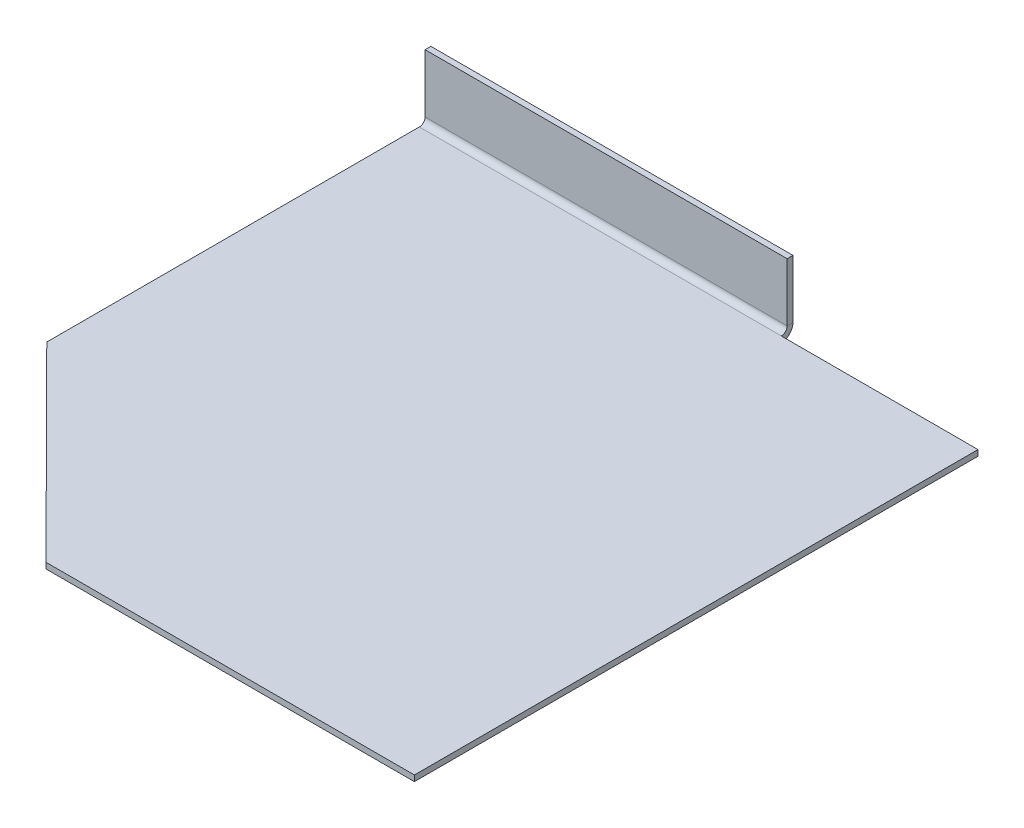
ISO-10303-21;
HEADER;
FILE_DESCRIPTION(('STEP AP214'),'2;1');
FILE_NAME('part.step','',(''),(''),'','','');
FILE_SCHEMA(('AUTOMOTIVE_DESIGN { 1 0 10303 214 1 1 1 1 }'));
ENDSEC;
DATA;
#1=APPLICATION_CONTEXT('core data for automotive mechanical design processes');
#2=APPLICATION_PROTOCOL_DEFINITION('international standard','automotive_design',2000,#1);
#3=PRODUCT_CONTEXT('',#1,'mechanical');
#4=PRODUCT('Part','Part','',(#3));
#5=PRODUCT_RELATED_PRODUCT_CATEGORY('part','',(#4));
#6=PRODUCT_DEFINITION_FORMATION('','',#4);
#7=PRODUCT_DEFINITION_CONTEXT('part definition',#1,'design');
#8=PRODUCT_DEFINITION('design','',#6,#7);
#9=PRODUCT_DEFINITION_SHAPE('','',#8);
#10=(LENGTH_UNIT() NAMED_UNIT(*) SI_UNIT(.MILLI.,.METRE.));
#11=(NAMED_UNIT(*) PLANE_ANGLE_UNIT() SI_UNIT($,.RADIAN.));
#12=(NAMED_UNIT(*) SI_UNIT($,.STERADIAN.) SOLID_ANGLE_UNIT());
#13=UNCERTAINTY_MEASURE_WITH_UNIT(LENGTH_MEASURE(1.E-05),#10,'distance_accuracy_value','');
#14=(GEOMETRIC_REPRESENTATION_CONTEXT(3) GLOBAL_UNCERTAINTY_ASSIGNED_CONTEXT((#13)) GLOBAL_UNIT_ASSIGNED_CONTEXT((#10,
#11,#12)) REPRESENTATION_CONTEXT('',''));
#15=CARTESIAN_POINT('',(0.,0.,0.));
#16=DIRECTION('',(0.,0.,1.));
#17=DIRECTION('',(1.,0.,0.));
#18=AXIS2_PLACEMENT_3D('',#15,#16,#17);
#19=CARTESIAN_POINT('',(50.84064,-3.175,-599.346330946073));
#20=DIRECTION('',(0.,0.,1.));
#21=DIRECTION('',(1.,0.,0.));
#22=AXIS2_PLACEMENT_3D('',#19,#20,#21);
#23=PLANE('',#22);
#24=DIRECTION('',(0.,-1.,0.));
#25=VECTOR('',#24,1.);
#26=CARTESIAN_POINT('',(248.353520055999,0.,-599.346330946073));
#27=LINE('',#26,#25);
#28=CARTESIAN_POINT('',(248.353520055999,0.,-599.346330946073));
#29=VERTEX_POINT('',#28);
#30=CARTESIAN_POINT('',(248.353520055999,-3.17500000000002,-599.346330946073));
#31=VERTEX_POINT('',#30);
#32=EDGE_CURVE('E75',#29,#31,#27,.T.);
#33=ORIENTED_EDGE('',*,*,#32,.F.);
#34=DIRECTION('',(1.,0.,0.));
#35=VECTOR('',#34,1.);
#36=CARTESIAN_POINT('',(50.84064,0.,-599.346330946073));
#37=LINE('',#36,#35);
#38=CARTESIAN_POINT('',(355.64064,0.,-599.346330946073));
#39=VERTEX_POINT('',#38);
#40=EDGE_CURVE('E131',#29,#39,#37,.T.);
#41=ORIENTED_EDGE('',*,*,#40,.T.);
#42=DIRECTION('',(0.,1.,0.));
#43=VECTOR('',#42,1.);
#44=CARTESIAN_POINT('',(355.64064,-3.175,-599.346330946073));
#45=LINE('',#44,#43);
#46=CARTESIAN_POINT('',(355.64064,-3.175,-599.346330946073));
#47=VERTEX_POINT('',#46);
#48=EDGE_CURVE('E130',#47,#39,#45,.T.);
#49=ORIENTED_EDGE('',*,*,#48,.F.);
#50=DIRECTION('',(1.,0.,0.));
#51=VECTOR('',#50,1.);
#52=CARTESIAN_POINT('',(50.84064,-3.175,-599.346330946073));
#53=LINE('',#52,#51);
#54=EDGE_CURVE('E120',#31,#47,#53,.T.);
#55=ORIENTED_EDGE('',*,*,#54,.F.);
#56=EDGE_LOOP('',(#33,#41,#49,#55));
#57=FACE_BOUND('',#56,.T.);
#58=ADVANCED_FACE('F58',(#57),#23,.F.);
#59=CARTESIAN_POINT('',(50.84064,-3.175,-396.146330946073));
#60=DIRECTION('',(-0.708537940146742,0.,0.705672719731047));
#61=DIRECTION('',(0.705672719731047,0.,0.708537940146742));
#62=AXIS2_PLACEMENT_3D('',#59,#60,#61);
#63=PLANE('',#62);
#64=DIRECTION('',(0.705672719731047,0.,0.708537940146742));
#65=VECTOR('',#64,1.);
#66=CARTESIAN_POINT('',(50.84064,0.,-396.146330946073));
#67=LINE('',#66,#65);
#68=CARTESIAN_POINT('',(50.84064,0.,-396.146330946073));
#69=VERTEX_POINT('',#68);
#70=CARTESIAN_POINT('',(154.686,0.,-291.879330946073));
#71=VERTEX_POINT('',#70);
#72=EDGE_CURVE('E146',#69,#71,#67,.T.);
#73=ORIENTED_EDGE('',*,*,#72,.F.);
#74=DIRECTION('',(0.,1.,0.));
#75=VECTOR('',#74,1.);
#76=CARTESIAN_POINT('',(50.84064,-3.175,-396.146330946073));
#77=LINE('',#76,#75);
#78=CARTESIAN_POINT('',(50.84064,-3.175,-396.146330946073));
#79=VERTEX_POINT('',#78);
#80=EDGE_CURVE('E13',#79,#69,#77,.T.);
#81=ORIENTED_EDGE('',*,*,#80,.F.);
#82=DIRECTION('',(0.705672719731047,0.,0.708537940146742));
#83=VECTOR('',#82,1.);
#84=CARTESIAN_POINT('',(50.84064,-3.175,-396.146330946073));
#85=LINE('',#84,#83);
#86=CARTESIAN_POINT('',(154.686,-3.175,-291.879330946073));
#87=VERTEX_POINT('',#86);
#88=EDGE_CURVE('E140',#79,#87,#85,.T.);
#89=ORIENTED_EDGE('',*,*,#88,.T.);
#90=DIRECTION('',(0.,1.,0.));
#91=VECTOR('',#90,1.);
#92=CARTESIAN_POINT('',(154.686,-3.175,-291.879330946073));
#93=LINE('',#92,#91);
#94=EDGE_CURVE('E62',#87,#71,#93,.T.);
#95=ORIENTED_EDGE('',*,*,#94,.T.);
#96=EDGE_LOOP('',(#73,#81,#89,#95));
#97=FACE_BOUND('',#96,.T.);
#98=ADVANCED_FACE('F60',(#97),#63,.T.);
#99=CARTESIAN_POINT('',(50.84064,-3.175,-396.146330946073));
#100=DIRECTION('',(1.,0.,0.));
#101=DIRECTION('',(0.,0.,-1.));
#102=AXIS2_PLACEMENT_3D('',#99,#100,#101);
#103=PLANE('',#102);
#104=DIRECTION('',(0.,0.,-1.));
#105=VECTOR('',#104,1.);
#106=CARTESIAN_POINT('',(50.84064,0.,-396.146330946073));
#107=LINE('',#106,#105);
#108=CARTESIAN_POINT('',(50.84064,0.,-599.346330946073));
#109=VERTEX_POINT('',#108);
#110=EDGE_CURVE('E157',#69,#109,#107,.T.);
#111=ORIENTED_EDGE('',*,*,#110,.T.);
#112=DIRECTION('',(0.,1.,0.));
#113=VECTOR('',#112,1.);
#114=CARTESIAN_POINT('',(50.84064,-3.175,-599.346330946073));
#115=LINE('',#114,#113);
#116=CARTESIAN_POINT('',(50.84064,-3.175,-599.346330946073));
#117=VERTEX_POINT('',#116);
#118=EDGE_CURVE('E67',#117,#109,#115,.T.);
#119=ORIENTED_EDGE('',*,*,#118,.F.);
#120=DIRECTION('',(0.,0.,-1.));
#121=VECTOR('',#120,1.);
#122=CARTESIAN_POINT('',(50.84064,-3.175,-396.146330946073));
#123=LINE('',#122,#121);
#124=EDGE_CURVE('E144',#79,#117,#123,.T.);
#125=ORIENTED_EDGE('',*,*,#124,.F.);
#126=ORIENTED_EDGE('',*,*,#80,.T.);
#127=EDGE_LOOP('',(#111,#119,#125,#126));
#128=FACE_BOUND('',#127,.T.);
#129=ADVANCED_FACE('F165',(#128),#103,.F.);
#130=CARTESIAN_POINT('',(355.64064,-3.175,-291.879330946073));
#131=DIRECTION('',(1.,0.,0.));
#132=DIRECTION('',(0.,0.,-1.));
#133=AXIS2_PLACEMENT_3D('',#130,#131,#132);
#134=PLANE('',#133);
#135=DIRECTION('',(0.,0.,-1.));
#136=VECTOR('',#135,1.);
#137=CARTESIAN_POINT('',(355.64064,0.,-291.879330946073));
#138=LINE('',#137,#136);
#139=CARTESIAN_POINT('',(355.64064,0.,-291.879330946073));
#140=VERTEX_POINT('',#139);
#141=EDGE_CURVE('E152',#140,#39,#138,.T.);
#142=ORIENTED_EDGE('',*,*,#141,.F.);
#143=DIRECTION('',(0.,1.,0.));
#144=VECTOR('',#143,1.);
#145=CARTESIAN_POINT('',(355.64064,-3.175,-291.879330946073));
#146=LINE('',#145,#144);
#147=CARTESIAN_POINT('',(355.64064,-3.175,-291.879330946073));
#148=VERTEX_POINT('',#147);
#149=EDGE_CURVE('E135',#148,#140,#146,.T.);
#150=ORIENTED_EDGE('',*,*,#149,.F.);
#151=DIRECTION('',(0.,0.,-1.));
#152=VECTOR('',#151,1.);
#153=CARTESIAN_POINT('',(355.64064,-3.175,-291.879330946073));
#154=LINE('',#153,#152);
#155=EDGE_CURVE('E125',#148,#47,#154,.T.);
#156=ORIENTED_EDGE('',*,*,#155,.T.);
#157=ORIENTED_EDGE('',*,*,#48,.T.);
#158=EDGE_LOOP('',(#142,#150,#156,#157));
#159=FACE_BOUND('',#158,.T.);
#160=ADVANCED_FACE('F137',(#159),#134,.T.);
#161=CARTESIAN_POINT('',(154.686,-3.175,-291.879330946073));
#162=DIRECTION('',(0.,0.,1.));
#163=DIRECTION('',(1.,0.,0.));
#164=AXIS2_PLACEMENT_3D('',#161,#162,#163);
#165=PLANE('',#164);
#166=DIRECTION('',(1.,0.,0.));
#167=VECTOR('',#166,1.);
#168=CARTESIAN_POINT('',(154.686,0.,-291.879330946073));
#169=LINE('',#168,#167);
#170=EDGE_CURVE('E149',#71,#140,#169,.T.);
#171=ORIENTED_EDGE('',*,*,#170,.F.);
#172=ORIENTED_EDGE('',*,*,#94,.F.);
#173=DIRECTION('',(1.,0.,0.));
#174=VECTOR('',#173,1.);
#175=CARTESIAN_POINT('',(154.686,-3.175,-291.879330946073));
#176=LINE('',#175,#174);
#177=EDGE_CURVE('E138',#87,#148,#176,.T.);
#178=ORIENTED_EDGE('',*,*,#177,.T.);
#179=ORIENTED_EDGE('',*,*,#149,.T.);
#180=EDGE_LOOP('',(#171,#172,#178,#179));
#181=FACE_BOUND('',#180,.T.);
#182=ADVANCED_FACE('F160',(#181),#165,.T.);
#183=CARTESIAN_POINT('',(0.,-3.175,0.));
#184=DIRECTION('',(0.,1.,0.));
#185=DIRECTION('',(0.,0.,1.));
#186=AXIS2_PLACEMENT_3D('',#183,#184,#185);
#187=PLANE('',#186);
#188=ORIENTED_EDGE('',*,*,#88,.F.);
#189=ORIENTED_EDGE('',*,*,#124,.T.);
#190=EDGE_CURVE('E127',#117,#31,#53,.T.);
#191=ORIENTED_EDGE('',*,*,#190,.T.);
#192=ORIENTED_EDGE('',*,*,#54,.T.);
#193=ORIENTED_EDGE('',*,*,#155,.F.);
#194=ORIENTED_EDGE('',*,*,#177,.F.);
#195=EDGE_LOOP('',(#188,#189,#191,#192,#193,#194));
#196=FACE_BOUND('',#195,.T.);
#197=ADVANCED_FACE('F123',(#196),#187,.F.);
#198=CARTESIAN_POINT('',(0.,0.,0.));
#199=DIRECTION('',(0.,1.,0.));
#200=DIRECTION('',(0.,0.,1.));
#201=AXIS2_PLACEMENT_3D('',#198,#199,#200);
#202=PLANE('',#201);
#203=ORIENTED_EDGE('',*,*,#72,.T.);
#204=ORIENTED_EDGE('',*,*,#170,.T.);
#205=ORIENTED_EDGE('',*,*,#141,.T.);
#206=ORIENTED_EDGE('',*,*,#40,.F.);
#207=EDGE_CURVE('E154',#109,#29,#37,.T.);
#208=ORIENTED_EDGE('',*,*,#207,.F.);
#209=ORIENTED_EDGE('',*,*,#110,.F.);
#210=EDGE_LOOP('',(#203,#204,#205,#206,#208,#209));
#211=FACE_BOUND('',#210,.T.);
#212=ADVANCED_FACE('F162',(#211),#202,.T.);
#213=CARTESIAN_POINT('',(248.353520055999,3.17500000000002,-599.346330946073));
#214=DIRECTION('',(1.,0.,0.));
#215=DIRECTION('',(0.,0.,-1.));
#216=AXIS2_PLACEMENT_3D('',#213,#214,#215);
#217=PLANE('',#216);
#218=DIRECTION('',(0.,0.,1.));
#219=VECTOR('',#218,1.);
#220=CARTESIAN_POINT('',(248.353520055999,3.17500000000006,-605.696330946074));
#221=LINE('',#220,#219);
#222=CARTESIAN_POINT('',(248.353520055999,3.17500000000001,-602.521330946073));
#223=VERTEX_POINT('',#222);
#224=CARTESIAN_POINT('',(248.353520055999,3.175,-605.696330946073));
#225=VERTEX_POINT('',#224);
#226=EDGE_CURVE('E206',#223,#225,#221,.F.);
#227=ORIENTED_EDGE('',*,*,#226,.F.);
#228=CARTESIAN_POINT('',(248.353520055999,3.17500000000002,-599.346330946073));
#229=DIRECTION('',(-1.,0.,0.));
#230=DIRECTION('',(0.,0.,1.));
#231=AXIS2_PLACEMENT_3D('',#228,#229,#230);
#232=CIRCLE('',#231,3.17500000000004);
#233=EDGE_CURVE('E184',#29,#223,#232,.F.);
#234=ORIENTED_EDGE('',*,*,#233,.F.);
#235=ORIENTED_EDGE('',*,*,#32,.T.);
#236=CARTESIAN_POINT('',(248.353520055999,3.17500000000002,-599.346330946073));
#237=DIRECTION('',(-1.,0.,0.));
#238=DIRECTION('',(0.,0.,1.));
#239=AXIS2_PLACEMENT_3D('',#236,#237,#238);
#240=CIRCLE('',#239,6.35000000000004);
#241=EDGE_CURVE('E179',#31,#225,#240,.F.);
#242=ORIENTED_EDGE('',*,*,#241,.T.);
#243=EDGE_LOOP('',(#227,#234,#235,#242));
#244=FACE_BOUND('',#243,.T.);
#245=ADVANCED_FACE('F197',(#244),#217,.T.);
#246=CARTESIAN_POINT('',(50.84064,3.17500000000002,-599.346330946073));
#247=DIRECTION('',(1.,0.,0.));
#248=DIRECTION('',(0.,0.,-1.));
#249=AXIS2_PLACEMENT_3D('',#246,#247,#248);
#250=PLANE('',#249);
#251=CARTESIAN_POINT('',(50.84064,3.17500000000002,-599.346330946073));
#252=DIRECTION('',(-1.,0.,0.));
#253=DIRECTION('',(0.,0.,1.));
#254=AXIS2_PLACEMENT_3D('',#251,#252,#253);
#255=CIRCLE('',#254,3.17500000000004);
#256=CARTESIAN_POINT('',(50.84064,3.17500000000001,-602.521330946073));
#257=VERTEX_POINT('',#256);
#258=EDGE_CURVE('E188',#257,#109,#255,.T.);
#259=ORIENTED_EDGE('',*,*,#258,.F.);
#260=DIRECTION('',(0.,0.,1.));
#261=VECTOR('',#260,1.);
#262=CARTESIAN_POINT('',(50.84064,3.17500000000004,-602.521330946073));
#263=LINE('',#262,#261);
#264=CARTESIAN_POINT('',(50.84064,3.17500000000006,-605.696330946073));
#265=VERTEX_POINT('',#264);
#266=EDGE_CURVE('E182',#257,#265,#263,.F.);
#267=ORIENTED_EDGE('',*,*,#266,.T.);
#268=CARTESIAN_POINT('',(50.84064,3.17500000000002,-599.346330946073));
#269=DIRECTION('',(-1.,0.,0.));
#270=DIRECTION('',(0.,0.,1.));
#271=AXIS2_PLACEMENT_3D('',#268,#269,#270);
#272=CIRCLE('',#271,6.35000000000004);
#273=EDGE_CURVE('E176',#265,#117,#272,.T.);
#274=ORIENTED_EDGE('',*,*,#273,.T.);
#275=ORIENTED_EDGE('',*,*,#118,.T.);
#276=EDGE_LOOP('',(#259,#267,#274,#275));
#277=FACE_BOUND('',#276,.T.);
#278=ADVANCED_FACE('F180',(#277),#250,.F.);
#279=CARTESIAN_POINT('',(50.84064,3.17500000000002,-599.346330946073));
#280=DIRECTION('',(-1.,0.,0.));
#281=DIRECTION('',(0.,0.,-1.));
#282=AXIS2_PLACEMENT_3D('',#279,#280,#281);
#283=CYLINDRICAL_SURFACE('',#282,6.35000000000004);
#284=ORIENTED_EDGE('',*,*,#190,.F.);
#285=ORIENTED_EDGE('',*,*,#273,.F.);
#286=DIRECTION('',(-1.,0.,0.));
#287=VECTOR('',#286,1.);
#288=CARTESIAN_POINT('',(0.,3.17500000000006,-605.696330946073));
#289=LINE('',#288,#287);
#290=EDGE_CURVE('E232',#225,#265,#289,.T.);
#291=ORIENTED_EDGE('',*,*,#290,.F.);
#292=ORIENTED_EDGE('',*,*,#241,.F.);
#293=EDGE_LOOP('',(#284,#285,#291,#292));
#294=FACE_BOUND('',#293,.T.);
#295=ADVANCED_FACE('F173',(#294),#283,.T.);
#296=CARTESIAN_POINT('',(50.84064,3.17500000000002,-599.346330946073));
#297=DIRECTION('',(-1.,0.,0.));
#298=DIRECTION('',(0.,0.,-1.));
#299=AXIS2_PLACEMENT_3D('',#296,#297,#298);
#300=CYLINDRICAL_SURFACE('',#299,3.17500000000004);
#301=ORIENTED_EDGE('',*,*,#207,.T.);
#302=ORIENTED_EDGE('',*,*,#233,.T.);
#303=DIRECTION('',(1.,0.,0.));
#304=VECTOR('',#303,1.);
#305=CARTESIAN_POINT('',(248.353520055999,3.17500000000004,-602.521330946073));
#306=LINE('',#305,#304);
#307=EDGE_CURVE('E255',#223,#257,#306,.F.);
#308=ORIENTED_EDGE('',*,*,#307,.T.);
#309=ORIENTED_EDGE('',*,*,#258,.T.);
#310=EDGE_LOOP('',(#301,#302,#308,#309));
#311=FACE_BOUND('',#310,.T.);
#312=ADVANCED_FACE('F291',(#311),#300,.F.);
#313=CARTESIAN_POINT('',(50.84064,34.925,-605.696330946073));
#314=DIRECTION('',(1.,0.,0.));
#315=DIRECTION('',(0.,1.,0.));
#316=AXIS2_PLACEMENT_3D('',#313,#314,#315);
#317=PLANE('',#316);
#318=ORIENTED_EDGE('',*,*,#266,.F.);
#319=DIRECTION('',(0.,1.,0.));
#320=VECTOR('',#319,1.);
#321=CARTESIAN_POINT('',(50.84064,34.925,-602.521330946073));
#322=LINE('',#321,#320);
#323=CARTESIAN_POINT('',(50.84064,34.925,-602.521330946073));
#324=VERTEX_POINT('',#323);
#325=EDGE_CURVE('E227',#257,#324,#322,.T.);
#326=ORIENTED_EDGE('',*,*,#325,.T.);
#327=DIRECTION('',(0.,0.,1.));
#328=VECTOR('',#327,1.);
#329=CARTESIAN_POINT('',(50.84064,34.925,-605.696330946073));
#330=LINE('',#329,#328);
#331=CARTESIAN_POINT('',(50.84064,34.925,-605.696330946073));
#332=VERTEX_POINT('',#331);
#333=EDGE_CURVE('E193',#332,#324,#330,.T.);
#334=ORIENTED_EDGE('',*,*,#333,.F.);
#335=DIRECTION('',(0.,-1.,0.));
#336=VECTOR('',#335,1.);
#337=CARTESIAN_POINT('',(50.84064,-1.9264351294444E-12,-605.696330946073));
#338=LINE('',#337,#336);
#339=EDGE_CURVE('E250',#265,#332,#338,.F.);
#340=ORIENTED_EDGE('',*,*,#339,.F.);
#341=EDGE_LOOP('',(#318,#326,#334,#340));
#342=FACE_BOUND('',#341,.T.);
#343=ADVANCED_FACE('F228',(#342),#317,.F.);
#344=CARTESIAN_POINT('',(248.353520055999,34.925,-605.696330946073));
#345=DIRECTION('',(-1.,0.,0.));
#346=DIRECTION('',(0.,0.,1.));
#347=AXIS2_PLACEMENT_3D('',#344,#345,#346);
#348=PLANE('',#347);
#349=ORIENTED_EDGE('',*,*,#226,.T.);
#350=DIRECTION('',(0.,1.,0.));
#351=VECTOR('',#350,1.);
#352=CARTESIAN_POINT('',(248.353520055999,-1.91633411850763E-12,-605.696330946073));
#353=LINE('',#352,#351);
#354=CARTESIAN_POINT('',(248.353520055999,34.925,-605.696330946073));
#355=VERTEX_POINT('',#354);
#356=EDGE_CURVE('E244',#355,#225,#353,.F.);
#357=ORIENTED_EDGE('',*,*,#356,.F.);
#358=DIRECTION('',(0.,0.,1.));
#359=VECTOR('',#358,1.);
#360=CARTESIAN_POINT('',(248.353520055999,34.925,-605.696330946073));
#361=LINE('',#360,#359);
#362=CARTESIAN_POINT('',(248.353520055999,34.925,-602.521330946073));
#363=VERTEX_POINT('',#362);
#364=EDGE_CURVE('E242',#355,#363,#361,.T.);
#365=ORIENTED_EDGE('',*,*,#364,.T.);
#366=DIRECTION('',(0.,-1.,0.));
#367=VECTOR('',#366,1.);
#368=CARTESIAN_POINT('',(248.353520055999,34.925,-602.521330946073));
#369=LINE('',#368,#367);
#370=EDGE_CURVE('E237',#363,#223,#369,.T.);
#371=ORIENTED_EDGE('',*,*,#370,.T.);
#372=EDGE_LOOP('',(#349,#357,#365,#371));
#373=FACE_BOUND('',#372,.T.);
#374=ADVANCED_FACE('F258',(#373),#348,.F.);
#375=CARTESIAN_POINT('',(0.,-1.91633411850763E-12,-605.696330946073));
#376=DIRECTION('',(0.,0.,-1.));
#377=DIRECTION('',(0.,1.,0.));
#378=AXIS2_PLACEMENT_3D('',#375,#376,#377);
#379=PLANE('',#378);
#380=ORIENTED_EDGE('',*,*,#356,.T.);
#381=ORIENTED_EDGE('',*,*,#290,.T.);
#382=ORIENTED_EDGE('',*,*,#339,.T.);
#383=DIRECTION('',(-1.,0.,0.));
#384=VECTOR('',#383,1.);
#385=CARTESIAN_POINT('',(0.,34.925,-605.696330946073));
#386=LINE('',#385,#384);
#387=EDGE_CURVE('E241',#332,#355,#386,.F.);
#388=ORIENTED_EDGE('',*,*,#387,.T.);
#389=EDGE_LOOP('',(#380,#381,#382,#388));
#390=FACE_BOUND('',#389,.T.);
#391=ADVANCED_FACE('F260',(#390),#379,.T.);
#392=CARTESIAN_POINT('',(0.,-1.9052486652568E-12,-602.521330946073));
#393=DIRECTION('',(0.,0.,-1.));
#394=DIRECTION('',(0.,1.,0.));
#395=AXIS2_PLACEMENT_3D('',#392,#393,#394);
#396=PLANE('',#395);
#397=ORIENTED_EDGE('',*,*,#307,.F.);
#398=ORIENTED_EDGE('',*,*,#370,.F.);
#399=DIRECTION('',(1.,0.,0.));
#400=VECTOR('',#399,1.);
#401=CARTESIAN_POINT('',(248.353520055999,34.925,-602.521330946073));
#402=LINE('',#401,#400);
#403=EDGE_CURVE('E221',#324,#363,#402,.T.);
#404=ORIENTED_EDGE('',*,*,#403,.F.);
#405=ORIENTED_EDGE('',*,*,#325,.F.);
#406=EDGE_LOOP('',(#397,#398,#404,#405));
#407=FACE_BOUND('',#406,.T.);
#408=ADVANCED_FACE('F235',(#407),#396,.F.);
#409=CARTESIAN_POINT('',(248.353520055999,34.925,-605.696330946073));
#410=DIRECTION('',(0.,-1.,0.));
#411=DIRECTION('',(0.,0.,-1.));
#412=AXIS2_PLACEMENT_3D('',#409,#410,#411);
#413=PLANE('',#412);
#414=ORIENTED_EDGE('',*,*,#403,.T.);
#415=ORIENTED_EDGE('',*,*,#364,.F.);
#416=ORIENTED_EDGE('',*,*,#387,.F.);
#417=ORIENTED_EDGE('',*,*,#333,.T.);
#418=EDGE_LOOP('',(#414,#415,#416,#417));
#419=FACE_BOUND('',#418,.T.);
#420=ADVANCED_FACE('F240',(#419),#413,.F.);
#421=CLOSED_SHELL('',(#58,#98,#129,#160,#182,#197,#212,#245,#278,#295,#312,#343,#374,#391,#408,#420));
#422=MANIFOLD_SOLID_BREP('B2',#421);
#423=ADVANCED_BREP_SHAPE_REPRESENTATION('',(#18,#422),#14);
#424=SHAPE_DEFINITION_REPRESENTATION(#9,#423);
ENDSEC;
END-ISO-10303-21;
